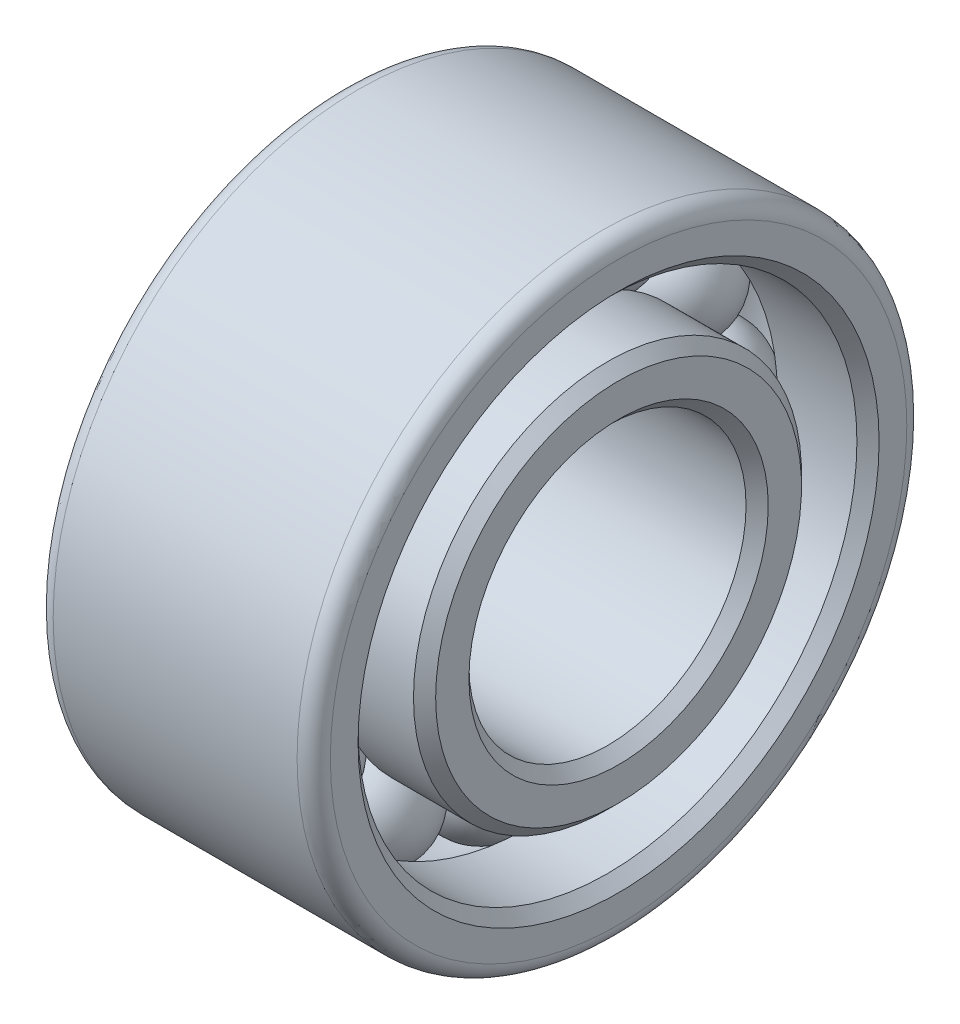
ISO-10303-21;
HEADER;
FILE_DESCRIPTION(('STEP AP214'),'2;1');
FILE_NAME('part.step','',(''),(''),'','','');
FILE_SCHEMA(('AUTOMOTIVE_DESIGN { 1 0 10303 214 1 1 1 1 }'));
ENDSEC;
DATA;
#1=APPLICATION_CONTEXT('core data for automotive mechanical design processes');
#2=APPLICATION_PROTOCOL_DEFINITION('international standard','automotive_design',2000,#1);
#3=PRODUCT_CONTEXT('',#1,'mechanical');
#4=PRODUCT('Part','Part','',(#3));
#5=PRODUCT_RELATED_PRODUCT_CATEGORY('part','',(#4));
#6=PRODUCT_DEFINITION_FORMATION('','',#4);
#7=PRODUCT_DEFINITION_CONTEXT('part definition',#1,'design');
#8=PRODUCT_DEFINITION('design','',#6,#7);
#9=PRODUCT_DEFINITION_SHAPE('','',#8);
#10=(LENGTH_UNIT() NAMED_UNIT(*) SI_UNIT(.MILLI.,.METRE.));
#11=(NAMED_UNIT(*) PLANE_ANGLE_UNIT() SI_UNIT($,.RADIAN.));
#12=(NAMED_UNIT(*) SI_UNIT($,.STERADIAN.) SOLID_ANGLE_UNIT());
#13=UNCERTAINTY_MEASURE_WITH_UNIT(LENGTH_MEASURE(1.E-05),#10,'distance_accuracy_value','');
#14=(GEOMETRIC_REPRESENTATION_CONTEXT(3) GLOBAL_UNCERTAINTY_ASSIGNED_CONTEXT((#13)) GLOBAL_UNIT_ASSIGNED_CONTEXT((#10,
#11,#12)) REPRESENTATION_CONTEXT('',''));
#15=CARTESIAN_POINT('',(0.,0.,0.));
#16=DIRECTION('',(0.,0.,1.));
#17=DIRECTION('',(1.,0.,0.));
#18=AXIS2_PLACEMENT_3D('',#15,#16,#17);
#19=CARTESIAN_POINT('',(2.5,0.96410161513778,1.99999999999996));
#20=DIRECTION('',(0.,0.866025403784445,0.499999999999989));
#21=DIRECTION('',(-1.,0.,0.));
#22=AXIS2_PLACEMENT_3D('',#19,#20,#21);
#23=SPHERICAL_SURFACE('',#22,1.);
#24=CARTESIAN_POINT('',(2.5,1.83012701892222,2.49999999999994));
#25=VERTEX_POINT('',#24);
#26=VERTEX_LOOP('',#25);
#27=FACE_BOUND('',#26,.T.);
#28=ADVANCED_FACE('F39',(#27),#23,.T.);
#29=CLOSED_SHELL('',(#28));
#30=MANIFOLD_SOLID_BREP('B2',#29);
#31=CARTESIAN_POINT('',(2.5,-0.49999999999996,3.46410161513773));
#32=DIRECTION('',(0.,0.50000000000001,0.866025403784433));
#33=DIRECTION('',(-1.,0.,0.));
#34=AXIS2_PLACEMENT_3D('',#31,#32,#33);
#35=SPHERICAL_SURFACE('',#34,1.);
#36=CARTESIAN_POINT('',(2.5,0.,4.33012701892216));
#37=VERTEX_POINT('',#36);
#38=VERTEX_LOOP('',#37);
#39=FACE_BOUND('',#38,.T.);
#40=ADVANCED_FACE('F59',(#39),#35,.T.);
#41=CLOSED_SHELL('',(#40));
#42=MANIFOLD_SOLID_BREP('B6',#41);
#43=CARTESIAN_POINT('',(2.5,-2.49999999999996,4.));
#44=DIRECTION('',(0.,0.,1.));
#45=DIRECTION('',(-1.,0.,0.));
#46=AXIS2_PLACEMENT_3D('',#43,#44,#45);
#47=SPHERICAL_SURFACE('',#46,1.);
#48=CARTESIAN_POINT('',(2.5,-2.49999999999995,5.));
#49=VERTEX_POINT('',#48);
#50=VERTEX_LOOP('',#49);
#51=FACE_BOUND('',#50,.T.);
#52=ADVANCED_FACE('F79',(#51),#47,.T.);
#53=CLOSED_SHELL('',(#52));
#54=MANIFOLD_SOLID_BREP('B35',#53);
#55=CARTESIAN_POINT('',(2.5,-4.49999999999997,3.46410161513777));
#56=DIRECTION('',(0.,-0.499999999999992,0.866025403784443));
#57=DIRECTION('',(-1.,0.,0.));
#58=AXIS2_PLACEMENT_3D('',#55,#56,#57);
#59=SPHERICAL_SURFACE('',#58,1.);
#60=CARTESIAN_POINT('',(2.5,-4.99999999999996,4.33012701892222));
#61=VERTEX_POINT('',#60);
#62=VERTEX_LOOP('',#61);
#63=FACE_BOUND('',#62,.T.);
#64=ADVANCED_FACE('F99',(#63),#59,.T.);
#65=CLOSED_SHELL('',(#64));
#66=MANIFOLD_SOLID_BREP('B55',#65);
#67=CARTESIAN_POINT('',(2.5,-5.96410161513774,2.00000000000003));
#68=DIRECTION('',(0.,-0.866025403784435,0.500000000000007));
#69=DIRECTION('',(-1.,0.,0.));
#70=AXIS2_PLACEMENT_3D('',#67,#68,#69);
#71=SPHERICAL_SURFACE('',#70,1.);
#72=CARTESIAN_POINT('',(2.5,-6.83012701892217,2.50000000000004));
#73=VERTEX_POINT('',#72);
#74=VERTEX_LOOP('',#73);
#75=FACE_BOUND('',#74,.T.);
#76=ADVANCED_FACE('F119',(#75),#71,.T.);
#77=CLOSED_SHELL('',(#76));
#78=MANIFOLD_SOLID_BREP('B75',#77);
#79=CARTESIAN_POINT('',(2.5,-6.5,0.));
#80=DIRECTION('',(0.,-1.,0.));
#81=DIRECTION('',(-1.,0.,0.));
#82=AXIS2_PLACEMENT_3D('',#79,#80,#81);
#83=SPHERICAL_SURFACE('',#82,1.);
#84=CARTESIAN_POINT('',(2.5,-7.5,0.));
#85=VERTEX_POINT('',#84);
#86=VERTEX_LOOP('',#85);
#87=FACE_BOUND('',#86,.T.);
#88=ADVANCED_FACE('F139',(#87),#83,.T.);
#89=CLOSED_SHELL('',(#88));
#90=MANIFOLD_SOLID_BREP('B95',#89);
#91=CARTESIAN_POINT('',(2.5,-5.96410161513777,-1.99999999999998));
#92=DIRECTION('',(0.,-0.866025403784442,-0.499999999999995));
#93=DIRECTION('',(-1.,0.,0.));
#94=AXIS2_PLACEMENT_3D('',#91,#92,#93);
#95=SPHERICAL_SURFACE('',#94,1.);
#96=CARTESIAN_POINT('',(2.5,-6.83012701892221,-2.49999999999997));
#97=VERTEX_POINT('',#96);
#98=VERTEX_LOOP('',#97);
#99=FACE_BOUND('',#98,.T.);
#100=ADVANCED_FACE('F159',(#99),#95,.T.);
#101=CLOSED_SHELL('',(#100));
#102=MANIFOLD_SOLID_BREP('B115',#101);
#103=CARTESIAN_POINT('',(2.5,-4.50000000000002,-3.46410161513775));
#104=DIRECTION('',(0.,-0.500000000000004,-0.866025403784436));
#105=DIRECTION('',(-1.,0.,0.));
#106=AXIS2_PLACEMENT_3D('',#103,#104,#105);
#107=SPHERICAL_SURFACE('',#106,1.);
#108=CARTESIAN_POINT('',(2.5,-5.00000000000002,-4.33012701892218));
#109=VERTEX_POINT('',#108);
#110=VERTEX_LOOP('',#109);
#111=FACE_BOUND('',#110,.T.);
#112=ADVANCED_FACE('F179',(#111),#107,.T.);
#113=CLOSED_SHELL('',(#112));
#114=MANIFOLD_SOLID_BREP('B135',#113);
#115=CARTESIAN_POINT('',(2.5,-2.50000000000001,-4.));
#116=DIRECTION('',(0.,0.,-1.));
#117=DIRECTION('',(-1.,0.,0.));
#118=AXIS2_PLACEMENT_3D('',#115,#116,#117);
#119=SPHERICAL_SURFACE('',#118,1.);
#120=CARTESIAN_POINT('',(2.5,-2.50000000000002,-5.));
#121=VERTEX_POINT('',#120);
#122=VERTEX_LOOP('',#121);
#123=FACE_BOUND('',#122,.T.);
#124=ADVANCED_FACE('F199',(#123),#119,.T.);
#125=CLOSED_SHELL('',(#124));
#126=MANIFOLD_SOLID_BREP('B155',#125);
#127=CARTESIAN_POINT('',(2.5,-0.500000000000008,-3.46410161513776));
#128=DIRECTION('',(0.,0.499999999999998,-0.86602540378444));
#129=DIRECTION('',(-1.,0.,0.));
#130=AXIS2_PLACEMENT_3D('',#127,#128,#129);
#131=SPHERICAL_SURFACE('',#130,1.);
#132=CARTESIAN_POINT('',(2.5,0.,-4.3301270189222));
#133=VERTEX_POINT('',#132);
#134=VERTEX_LOOP('',#133);
#135=FACE_BOUND('',#134,.T.);
#136=ADVANCED_FACE('F219',(#135),#131,.T.);
#137=CLOSED_SHELL('',(#136));
#138=MANIFOLD_SOLID_BREP('B175',#137);
#139=CARTESIAN_POINT('',(2.5,0.964101615137752,-2.));
#140=DIRECTION('',(0.,0.866025403784438,-0.500000000000001));
#141=DIRECTION('',(-1.,0.,0.));
#142=AXIS2_PLACEMENT_3D('',#139,#140,#141);
#143=SPHERICAL_SURFACE('',#142,1.);
#144=CARTESIAN_POINT('',(2.5,1.83012701892219,-2.5));
#145=VERTEX_POINT('',#144);
#146=VERTEX_LOOP('',#145);
#147=FACE_BOUND('',#146,.T.);
#148=ADVANCED_FACE('F239',(#147),#143,.T.);
#149=CLOSED_SHELL('',(#148));
#150=MANIFOLD_SOLID_BREP('B195',#149);
#151=CARTESIAN_POINT('',(2.5,1.5,0.));
#152=DIRECTION('',(0.,1.,0.));
#153=DIRECTION('',(-1.,0.,0.));
#154=AXIS2_PLACEMENT_3D('',#151,#152,#153);
#155=SPHERICAL_SURFACE('',#154,1.);
#156=CARTESIAN_POINT('',(2.5,2.5,0.));
#157=VERTEX_POINT('',#156);
#158=VERTEX_LOOP('',#157);
#159=FACE_BOUND('',#158,.T.);
#160=ADVANCED_FACE('F261',(#159),#155,.T.);
#161=CLOSED_SHELL('',(#160));
#162=MANIFOLD_SOLID_BREP('B215',#161);
#163=CARTESIAN_POINT('',(0.,2.,0.));
#164=DIRECTION('',(1.,0.,0.));
#165=DIRECTION('',(0.,0.,-1.));
#166=AXIS2_PLACEMENT_3D('',#163,#164,#165);
#167=PLANE('',#166);
#168=CARTESIAN_POINT('',(0.,-2.5,0.));
#169=DIRECTION('',(1.,0.,0.));
#170=DIRECTION('',(0.,0.,-1.));
#171=AXIS2_PLACEMENT_3D('',#168,#169,#170);
#172=CIRCLE('',#171,4.7);
#173=CARTESIAN_POINT('',(0.,-2.5,-4.7));
#174=VERTEX_POINT('',#173);
#175=EDGE_CURVE('E291',#174,#174,#172,.T.);
#176=ORIENTED_EDGE('',*,*,#175,.T.);
#177=EDGE_LOOP('',(#176));
#178=FACE_BOUND('',#177,.T.);
#179=CARTESIAN_POINT('',(0.,-2.5,0.));
#180=DIRECTION('',(1.,0.,0.));
#181=DIRECTION('',(0.,0.,-1.));
#182=AXIS2_PLACEMENT_3D('',#179,#180,#181);
#183=CIRCLE('',#182,5.2);
#184=CARTESIAN_POINT('',(0.,-2.5,-5.2));
#185=VERTEX_POINT('',#184);
#186=EDGE_CURVE('E300',#185,#185,#183,.F.);
#187=ORIENTED_EDGE('',*,*,#186,.T.);
#188=EDGE_LOOP('',(#187));
#189=FACE_BOUND('',#188,.T.);
#190=ADVANCED_FACE('F280',(#178,#189),#167,.F.);
#191=CARTESIAN_POINT('',(-1.0669014084507,-2.5,0.));
#192=DIRECTION('',(-1.,0.,0.));
#193=DIRECTION('',(0.,0.,1.));
#194=AXIS2_PLACEMENT_3D('',#191,#192,#193);
#195=CYLINDRICAL_SURFACE('',#194,4.5);
#196=CARTESIAN_POINT('',(0.199999999999998,-2.5,0.));
#197=DIRECTION('',(1.,0.,0.));
#198=DIRECTION('',(0.,0.,-1.));
#199=AXIS2_PLACEMENT_3D('',#196,#197,#198);
#200=CIRCLE('',#199,4.5);
#201=CARTESIAN_POINT('',(0.199999999999998,-2.5,-4.5));
#202=VERTEX_POINT('',#201);
#203=EDGE_CURVE('E295',#202,#202,#200,.F.);
#204=ORIENTED_EDGE('',*,*,#203,.T.);
#205=EDGE_LOOP('',(#204));
#206=FACE_BOUND('',#205,.T.);
#207=CARTESIAN_POINT('',(1.63397459621556,-2.5,0.));
#208=DIRECTION('',(-1.,0.,0.));
#209=DIRECTION('',(0.,0.,1.));
#210=AXIS2_PLACEMENT_3D('',#207,#208,#209);
#211=CIRCLE('',#210,4.5);
#212=CARTESIAN_POINT('',(1.63397459621556,-2.5,4.5));
#213=VERTEX_POINT('',#212);
#214=EDGE_CURVE('E312',#213,#213,#211,.T.);
#215=ORIENTED_EDGE('',*,*,#214,.F.);
#216=EDGE_LOOP('',(#215));
#217=FACE_BOUND('',#216,.T.);
#218=ADVANCED_FACE('F324',(#206,#217),#195,.F.);
#219=CARTESIAN_POINT('',(2.5,-2.5,0.));
#220=DIRECTION('',(-1.,0.,0.));
#221=DIRECTION('',(0.,0.,1.));
#222=AXIS2_PLACEMENT_3D('',#219,#220,#221);
#223=TOROIDAL_SURFACE('',#222,4.,1.);
#224=CARTESIAN_POINT('',(3.36602540378444,-2.5,0.));
#225=DIRECTION('',(-1.,0.,0.));
#226=DIRECTION('',(0.,0.,1.));
#227=AXIS2_PLACEMENT_3D('',#224,#225,#226);
#228=CIRCLE('',#227,4.5);
#229=CARTESIAN_POINT('',(3.36602540378444,-2.5,4.5));
#230=VERTEX_POINT('',#229);
#231=EDGE_CURVE('E315',#230,#230,#228,.T.);
#232=ORIENTED_EDGE('',*,*,#231,.F.);
#233=EDGE_LOOP('',(#232));
#234=FACE_BOUND('',#233,.T.);
#235=ORIENTED_EDGE('',*,*,#214,.T.);
#236=EDGE_LOOP('',(#235));
#237=FACE_BOUND('',#236,.T.);
#238=ADVANCED_FACE('F321',(#234,#237),#223,.F.);
#239=CARTESIAN_POINT('',(-1.0669014084507,-2.5,0.));
#240=DIRECTION('',(-1.,0.,0.));
#241=DIRECTION('',(0.,0.,1.));
#242=AXIS2_PLACEMENT_3D('',#239,#240,#241);
#243=CYLINDRICAL_SURFACE('',#242,4.5);
#244=CARTESIAN_POINT('',(4.8,-2.5,0.));
#245=DIRECTION('',(-1.,0.,0.));
#246=DIRECTION('',(0.,0.,1.));
#247=AXIS2_PLACEMENT_3D('',#244,#245,#246);
#248=CIRCLE('',#247,4.5);
#249=CARTESIAN_POINT('',(4.8,-2.5,4.5));
#250=VERTEX_POINT('',#249);
#251=EDGE_CURVE('E260',#250,#250,#248,.F.);
#252=ORIENTED_EDGE('',*,*,#251,.T.);
#253=EDGE_LOOP('',(#252));
#254=FACE_BOUND('',#253,.T.);
#255=ORIENTED_EDGE('',*,*,#231,.T.);
#256=EDGE_LOOP('',(#255));
#257=FACE_BOUND('',#256,.T.);
#258=ADVANCED_FACE('F319',(#254,#257),#243,.F.);
#259=CARTESIAN_POINT('',(5.,2.,0.));
#260=DIRECTION('',(-1.,0.,0.));
#261=DIRECTION('',(0.,0.,1.));
#262=AXIS2_PLACEMENT_3D('',#259,#260,#261);
#263=PLANE('',#262);
#264=CARTESIAN_POINT('',(5.,-2.5,0.));
#265=DIRECTION('',(-1.,0.,0.));
#266=DIRECTION('',(0.,0.,1.));
#267=AXIS2_PLACEMENT_3D('',#264,#265,#266);
#268=CIRCLE('',#267,4.7);
#269=CARTESIAN_POINT('',(5.,-2.5,4.7));
#270=VERTEX_POINT('',#269);
#271=EDGE_CURVE('E287',#270,#270,#268,.T.);
#272=ORIENTED_EDGE('',*,*,#271,.T.);
#273=EDGE_LOOP('',(#272));
#274=FACE_BOUND('',#273,.T.);
#275=CARTESIAN_POINT('',(5.,-2.5,0.));
#276=DIRECTION('',(-1.,0.,0.));
#277=DIRECTION('',(0.,0.,1.));
#278=AXIS2_PLACEMENT_3D('',#275,#276,#277);
#279=CIRCLE('',#278,5.2);
#280=CARTESIAN_POINT('',(5.,-2.5,5.2));
#281=VERTEX_POINT('',#280);
#282=EDGE_CURVE('E303',#281,#281,#279,.F.);
#283=ORIENTED_EDGE('',*,*,#282,.T.);
#284=EDGE_LOOP('',(#283));
#285=FACE_BOUND('',#284,.T.);
#286=ADVANCED_FACE('F372',(#274,#285),#263,.F.);
#287=CARTESIAN_POINT('',(-1.0669014084507,-2.5,0.));
#288=DIRECTION('',(-1.,0.,0.));
#289=DIRECTION('',(0.,0.,1.));
#290=AXIS2_PLACEMENT_3D('',#287,#288,#289);
#291=CYLINDRICAL_SURFACE('',#290,5.5);
#292=CARTESIAN_POINT('',(4.7,-2.5,0.));
#293=DIRECTION('',(-1.,0.,0.));
#294=DIRECTION('',(0.,0.,1.));
#295=AXIS2_PLACEMENT_3D('',#292,#293,#294);
#296=CIRCLE('',#295,5.5);
#297=CARTESIAN_POINT('',(4.7,-2.5,5.5));
#298=VERTEX_POINT('',#297);
#299=EDGE_CURVE('E306',#298,#298,#296,.T.);
#300=ORIENTED_EDGE('',*,*,#299,.T.);
#301=EDGE_LOOP('',(#300));
#302=FACE_BOUND('',#301,.T.);
#303=CARTESIAN_POINT('',(0.3,-2.5,0.));
#304=DIRECTION('',(1.,0.,0.));
#305=DIRECTION('',(0.,0.,-1.));
#306=AXIS2_PLACEMENT_3D('',#303,#304,#305);
#307=CIRCLE('',#306,5.5);
#308=CARTESIAN_POINT('',(0.3,-2.5,-5.5));
#309=VERTEX_POINT('',#308);
#310=EDGE_CURVE('E309',#309,#309,#307,.T.);
#311=ORIENTED_EDGE('',*,*,#310,.T.);
#312=EDGE_LOOP('',(#311));
#313=FACE_BOUND('',#312,.T.);
#314=ADVANCED_FACE('F342',(#302,#313),#291,.T.);
#315=CARTESIAN_POINT('',(4.7,-2.5,0.));
#316=DIRECTION('',(-1.,0.,0.));
#317=DIRECTION('',(0.,0.,1.));
#318=AXIS2_PLACEMENT_3D('',#315,#316,#317);
#319=TOROIDAL_SURFACE('',#318,5.2,0.3);
#320=ORIENTED_EDGE('',*,*,#282,.F.);
#321=EDGE_LOOP('',(#320));
#322=FACE_BOUND('',#321,.T.);
#323=ORIENTED_EDGE('',*,*,#299,.F.);
#324=EDGE_LOOP('',(#323));
#325=FACE_BOUND('',#324,.T.);
#326=ADVANCED_FACE('F338',(#322,#325),#319,.T.);
#327=CARTESIAN_POINT('',(0.3,-2.5,0.));
#328=DIRECTION('',(1.,0.,0.));
#329=DIRECTION('',(0.,0.,-1.));
#330=AXIS2_PLACEMENT_3D('',#327,#328,#329);
#331=TOROIDAL_SURFACE('',#330,5.2,0.3);
#332=ORIENTED_EDGE('',*,*,#310,.F.);
#333=EDGE_LOOP('',(#332));
#334=FACE_BOUND('',#333,.T.);
#335=ORIENTED_EDGE('',*,*,#186,.F.);
#336=EDGE_LOOP('',(#335));
#337=FACE_BOUND('',#336,.T.);
#338=ADVANCED_FACE('F341',(#334,#337),#331,.T.);
#339=CARTESIAN_POINT('',(0.199999999999998,-2.5,0.));
#340=DIRECTION('',(-1.,0.,0.));
#341=DIRECTION('',(0.,0.,1.));
#342=AXIS2_PLACEMENT_3D('',#339,#340,#341);
#343=CONICAL_SURFACE('',#342,4.5,0.785398163397448);
#344=ORIENTED_EDGE('',*,*,#175,.F.);
#345=EDGE_LOOP('',(#344));
#346=FACE_BOUND('',#345,.T.);
#347=ORIENTED_EDGE('',*,*,#203,.F.);
#348=EDGE_LOOP('',(#347));
#349=FACE_BOUND('',#348,.T.);
#350=ADVANCED_FACE('F345',(#346,#349),#343,.F.);
#351=CARTESIAN_POINT('',(5.,-2.5,0.));
#352=DIRECTION('',(1.,0.,0.));
#353=DIRECTION('',(0.,0.,-1.));
#354=AXIS2_PLACEMENT_3D('',#351,#352,#353);
#355=CONICAL_SURFACE('',#354,4.7,0.785398163397448);
#356=ORIENTED_EDGE('',*,*,#251,.F.);
#357=EDGE_LOOP('',(#356));
#358=FACE_BOUND('',#357,.T.);
#359=ORIENTED_EDGE('',*,*,#271,.F.);
#360=EDGE_LOOP('',(#359));
#361=FACE_BOUND('',#360,.T.);
#362=ADVANCED_FACE('F282',(#358,#361),#355,.F.);
#363=CLOSED_SHELL('',(#190,#218,#238,#258,#286,#314,#326,#338,#350,#362));
#364=MANIFOLD_SOLID_BREP('B235',#363);
#365=CARTESIAN_POINT('',(0.,0.,0.));
#366=DIRECTION('',(1.,0.,0.));
#367=DIRECTION('',(0.,0.,-1.));
#368=AXIS2_PLACEMENT_3D('',#365,#366,#367);
#369=PLANE('',#368);
#370=CARTESIAN_POINT('',(0.,-2.5,0.));
#371=DIRECTION('',(1.,0.,0.));
#372=DIRECTION('',(0.,0.,-1.));
#373=AXIS2_PLACEMENT_3D('',#370,#371,#372);
#374=CIRCLE('',#373,3.3);
#375=CARTESIAN_POINT('',(0.,-2.5,-3.3));
#376=VERTEX_POINT('',#375);
#377=EDGE_CURVE('E438',#376,#376,#374,.F.);
#378=ORIENTED_EDGE('',*,*,#377,.T.);
#379=EDGE_LOOP('',(#378));
#380=FACE_BOUND('',#379,.T.);
#381=CARTESIAN_POINT('',(0.,-2.5,0.));
#382=DIRECTION('',(1.,0.,0.));
#383=DIRECTION('',(0.,0.,-1.));
#384=AXIS2_PLACEMENT_3D('',#381,#382,#383);
#385=CIRCLE('',#384,2.7);
#386=CARTESIAN_POINT('',(0.,-2.5,-2.7));
#387=VERTEX_POINT('',#386);
#388=EDGE_CURVE('E454',#387,#387,#385,.T.);
#389=ORIENTED_EDGE('',*,*,#388,.T.);
#390=EDGE_LOOP('',(#389));
#391=FACE_BOUND('',#390,.T.);
#392=ADVANCED_FACE('F431',(#380,#391),#369,.F.);
#393=CARTESIAN_POINT('',(-1.0669014084507,-2.5,0.));
#394=DIRECTION('',(-1.,0.,0.));
#395=DIRECTION('',(0.,0.,1.));
#396=AXIS2_PLACEMENT_3D('',#393,#394,#395);
#397=CYLINDRICAL_SURFACE('',#396,2.5);
#398=CARTESIAN_POINT('',(0.199999999999999,-2.5,0.));
#399=DIRECTION('',(1.,0.,0.));
#400=DIRECTION('',(0.,0.,-1.));
#401=AXIS2_PLACEMENT_3D('',#398,#399,#400);
#402=CIRCLE('',#401,2.5);
#403=CARTESIAN_POINT('',(0.199999999999999,-2.5,-2.5));
#404=VERTEX_POINT('',#403);
#405=EDGE_CURVE('E457',#404,#404,#402,.F.);
#406=ORIENTED_EDGE('',*,*,#405,.T.);
#407=EDGE_LOOP('',(#406));
#408=FACE_BOUND('',#407,.T.);
#409=CARTESIAN_POINT('',(4.8,-2.5,0.));
#410=DIRECTION('',(-1.,0.,0.));
#411=DIRECTION('',(0.,0.,1.));
#412=AXIS2_PLACEMENT_3D('',#409,#410,#411);
#413=CIRCLE('',#412,2.5);
#414=CARTESIAN_POINT('',(4.8,-2.5,2.5));
#415=VERTEX_POINT('',#414);
#416=EDGE_CURVE('E460',#415,#415,#413,.F.);
#417=ORIENTED_EDGE('',*,*,#416,.T.);
#418=EDGE_LOOP('',(#417));
#419=FACE_BOUND('',#418,.T.);
#420=ADVANCED_FACE('F486',(#408,#419),#397,.F.);
#421=CARTESIAN_POINT('',(5.,0.,0.));
#422=DIRECTION('',(-1.,0.,0.));
#423=DIRECTION('',(0.,0.,1.));
#424=AXIS2_PLACEMENT_3D('',#421,#422,#423);
#425=PLANE('',#424);
#426=CARTESIAN_POINT('',(5.,-2.5,0.));
#427=DIRECTION('',(-1.,0.,0.));
#428=DIRECTION('',(0.,0.,1.));
#429=AXIS2_PLACEMENT_3D('',#426,#427,#428);
#430=CIRCLE('',#429,3.3);
#431=CARTESIAN_POINT('',(5.,-2.5,3.3));
#432=VERTEX_POINT('',#431);
#433=EDGE_CURVE('E442',#432,#432,#430,.F.);
#434=ORIENTED_EDGE('',*,*,#433,.T.);
#435=EDGE_LOOP('',(#434));
#436=FACE_BOUND('',#435,.T.);
#437=CARTESIAN_POINT('',(5.,-2.5,0.));
#438=DIRECTION('',(-1.,0.,0.));
#439=DIRECTION('',(0.,0.,1.));
#440=AXIS2_PLACEMENT_3D('',#437,#438,#439);
#441=CIRCLE('',#440,2.7);
#442=CARTESIAN_POINT('',(5.,-2.5,2.7));
#443=VERTEX_POINT('',#442);
#444=EDGE_CURVE('E451',#443,#443,#441,.T.);
#445=ORIENTED_EDGE('',*,*,#444,.T.);
#446=EDGE_LOOP('',(#445));
#447=FACE_BOUND('',#446,.T.);
#448=ADVANCED_FACE('F480',(#436,#447),#425,.F.);
#449=CARTESIAN_POINT('',(-1.0669014084507,-2.5,0.));
#450=DIRECTION('',(-1.,0.,0.));
#451=DIRECTION('',(0.,0.,1.));
#452=AXIS2_PLACEMENT_3D('',#449,#450,#451);
#453=CYLINDRICAL_SURFACE('',#452,3.5);
#454=CARTESIAN_POINT('',(4.8,-2.5,0.));
#455=DIRECTION('',(-1.,0.,0.));
#456=DIRECTION('',(0.,0.,1.));
#457=AXIS2_PLACEMENT_3D('',#454,#455,#456);
#458=CIRCLE('',#457,3.5);
#459=CARTESIAN_POINT('',(4.8,-2.5,3.5));
#460=VERTEX_POINT('',#459);
#461=EDGE_CURVE('E446',#460,#460,#458,.T.);
#462=ORIENTED_EDGE('',*,*,#461,.T.);
#463=EDGE_LOOP('',(#462));
#464=FACE_BOUND('',#463,.T.);
#465=CARTESIAN_POINT('',(3.36602540378444,-2.5,0.));
#466=DIRECTION('',(-1.,0.,0.));
#467=DIRECTION('',(0.,0.,1.));
#468=AXIS2_PLACEMENT_3D('',#465,#466,#467);
#469=CIRCLE('',#468,3.5);
#470=CARTESIAN_POINT('',(3.36602540378444,-2.5,3.5));
#471=VERTEX_POINT('',#470);
#472=EDGE_CURVE('E463',#471,#471,#469,.T.);
#473=ORIENTED_EDGE('',*,*,#472,.F.);
#474=EDGE_LOOP('',(#473));
#475=FACE_BOUND('',#474,.T.);
#476=ADVANCED_FACE('F475',(#464,#475),#453,.T.);
#477=CARTESIAN_POINT('',(2.5,-2.5,0.));
#478=DIRECTION('',(-1.,0.,0.));
#479=DIRECTION('',(0.,0.,1.));
#480=AXIS2_PLACEMENT_3D('',#477,#478,#479);
#481=TOROIDAL_SURFACE('',#480,4.,1.);
#482=CARTESIAN_POINT('',(1.63397459621556,-2.5,0.));
#483=DIRECTION('',(-1.,0.,0.));
#484=DIRECTION('',(0.,0.,1.));
#485=AXIS2_PLACEMENT_3D('',#482,#483,#484);
#486=CIRCLE('',#485,3.5);
#487=CARTESIAN_POINT('',(1.63397459621556,-2.5,3.5));
#488=VERTEX_POINT('',#487);
#489=EDGE_CURVE('E466',#488,#488,#486,.T.);
#490=ORIENTED_EDGE('',*,*,#489,.F.);
#491=EDGE_LOOP('',(#490));
#492=FACE_BOUND('',#491,.T.);
#493=ORIENTED_EDGE('',*,*,#472,.T.);
#494=EDGE_LOOP('',(#493));
#495=FACE_BOUND('',#494,.T.);
#496=ADVANCED_FACE('F472',(#492,#495),#481,.F.);
#497=CARTESIAN_POINT('',(-1.0669014084507,-2.5,0.));
#498=DIRECTION('',(-1.,0.,0.));
#499=DIRECTION('',(0.,0.,1.));
#500=AXIS2_PLACEMENT_3D('',#497,#498,#499);
#501=CYLINDRICAL_SURFACE('',#500,3.5);
#502=CARTESIAN_POINT('',(0.200000000000001,-2.5,0.));
#503=DIRECTION('',(1.,0.,0.));
#504=DIRECTION('',(0.,0.,-1.));
#505=AXIS2_PLACEMENT_3D('',#502,#503,#504);
#506=CIRCLE('',#505,3.5);
#507=CARTESIAN_POINT('',(0.200000000000001,-2.5,-3.5));
#508=VERTEX_POINT('',#507);
#509=EDGE_CURVE('E279',#508,#508,#506,.T.);
#510=ORIENTED_EDGE('',*,*,#509,.T.);
#511=EDGE_LOOP('',(#510));
#512=FACE_BOUND('',#511,.T.);
#513=ORIENTED_EDGE('',*,*,#489,.T.);
#514=EDGE_LOOP('',(#513));
#515=FACE_BOUND('',#514,.T.);
#516=ADVANCED_FACE('F470',(#512,#515),#501,.T.);
#517=CARTESIAN_POINT('',(0.199999999999999,-2.5,0.));
#518=DIRECTION('',(-1.,0.,0.));
#519=DIRECTION('',(0.,0.,1.));
#520=AXIS2_PLACEMENT_3D('',#517,#518,#519);
#521=CONICAL_SURFACE('',#520,2.5,0.785398163397448);
#522=ORIENTED_EDGE('',*,*,#388,.F.);
#523=EDGE_LOOP('',(#522));
#524=FACE_BOUND('',#523,.T.);
#525=ORIENTED_EDGE('',*,*,#405,.F.);
#526=EDGE_LOOP('',(#525));
#527=FACE_BOUND('',#526,.T.);
#528=ADVANCED_FACE('F498',(#524,#527),#521,.F.);
#529=CARTESIAN_POINT('',(5.,-2.5,0.));
#530=DIRECTION('',(1.,0.,0.));
#531=DIRECTION('',(0.,0.,-1.));
#532=AXIS2_PLACEMENT_3D('',#529,#530,#531);
#533=CONICAL_SURFACE('',#532,2.7,0.785398163397446);
#534=ORIENTED_EDGE('',*,*,#416,.F.);
#535=EDGE_LOOP('',(#534));
#536=FACE_BOUND('',#535,.T.);
#537=ORIENTED_EDGE('',*,*,#444,.F.);
#538=EDGE_LOOP('',(#537));
#539=FACE_BOUND('',#538,.T.);
#540=ADVANCED_FACE('F501',(#536,#539),#533,.F.);
#541=CARTESIAN_POINT('',(4.8,-2.5,0.));
#542=DIRECTION('',(-1.,0.,0.));
#543=DIRECTION('',(0.,0.,1.));
#544=AXIS2_PLACEMENT_3D('',#541,#542,#543);
#545=CONICAL_SURFACE('',#544,3.5,0.785398163397451);
#546=CARTESIAN_POINT('',(5.,-2.5,3.3));
#547=CARTESIAN_POINT('',(4.99791666666667,-2.5,3.30208333333333));
#548=CARTESIAN_POINT('',(4.99583333333333,-2.5,3.30416666666667));
#549=CARTESIAN_POINT('',(4.99166666666667,-2.5,3.30833333333333));
#550=CARTESIAN_POINT('',(4.98958333333333,-2.5,3.31041666666667));
#551=CARTESIAN_POINT('',(4.98541666666667,-2.5,3.31458333333333));
#552=CARTESIAN_POINT('',(4.98333333333333,-2.5,3.31666666666667));
#553=CARTESIAN_POINT('',(4.97916666666667,-2.5,3.32083333333333));
#554=CARTESIAN_POINT('',(4.97708333333333,-2.5,3.32291666666667));
#555=CARTESIAN_POINT('',(4.97291666666667,-2.5,3.32708333333333));
#556=CARTESIAN_POINT('',(4.97083333333333,-2.5,3.32916666666667));
#557=CARTESIAN_POINT('',(4.96666666666667,-2.5,3.33333333333333));
#558=CARTESIAN_POINT('',(4.96458333333333,-2.5,3.33541666666667));
#559=CARTESIAN_POINT('',(4.96041666666667,-2.5,3.33958333333333));
#560=CARTESIAN_POINT('',(4.95833333333333,-2.5,3.34166666666667));
#561=CARTESIAN_POINT('',(4.95416666666667,-2.5,3.34583333333333));
#562=CARTESIAN_POINT('',(4.95208333333333,-2.5,3.34791666666667));
#563=CARTESIAN_POINT('',(4.94791666666667,-2.5,3.35208333333333));
#564=CARTESIAN_POINT('',(4.94583333333333,-2.5,3.35416666666667));
#565=CARTESIAN_POINT('',(4.94166666666667,-2.5,3.35833333333333));
#566=CARTESIAN_POINT('',(4.93958333333333,-2.5,3.36041666666667));
#567=CARTESIAN_POINT('',(4.93541666666667,-2.5,3.36458333333333));
#568=CARTESIAN_POINT('',(4.93333333333333,-2.5,3.36666666666667));
#569=CARTESIAN_POINT('',(4.92916666666667,-2.5,3.37083333333333));
#570=CARTESIAN_POINT('',(4.92708333333333,-2.5,3.37291666666667));
#571=CARTESIAN_POINT('',(4.92291666666667,-2.5,3.37708333333333));
#572=CARTESIAN_POINT('',(4.92083333333333,-2.5,3.37916666666667));
#573=CARTESIAN_POINT('',(4.91666666666667,-2.5,3.38333333333333));
#574=CARTESIAN_POINT('',(4.91458333333333,-2.5,3.38541666666667));
#575=CARTESIAN_POINT('',(4.91041666666667,-2.5,3.38958333333333));
#576=CARTESIAN_POINT('',(4.90833333333333,-2.5,3.39166666666667));
#577=CARTESIAN_POINT('',(4.90416666666667,-2.5,3.39583333333333));
#578=CARTESIAN_POINT('',(4.90208333333333,-2.5,3.39791666666667));
#579=CARTESIAN_POINT('',(4.89791666666667,-2.5,3.40208333333333));
#580=CARTESIAN_POINT('',(4.89583333333333,-2.5,3.40416666666667));
#581=CARTESIAN_POINT('',(4.89166666666667,-2.5,3.40833333333333));
#582=CARTESIAN_POINT('',(4.88958333333333,-2.5,3.41041666666667));
#583=CARTESIAN_POINT('',(4.88541666666667,-2.5,3.41458333333333));
#584=CARTESIAN_POINT('',(4.88333333333333,-2.5,3.41666666666667));
#585=CARTESIAN_POINT('',(4.87916666666667,-2.5,3.42083333333333));
#586=CARTESIAN_POINT('',(4.87708333333333,-2.5,3.42291666666667));
#587=CARTESIAN_POINT('',(4.87291666666667,-2.5,3.42708333333333));
#588=CARTESIAN_POINT('',(4.87083333333333,-2.5,3.42916666666667));
#589=CARTESIAN_POINT('',(4.86666666666667,-2.5,3.43333333333333));
#590=CARTESIAN_POINT('',(4.86458333333333,-2.5,3.43541666666667));
#591=CARTESIAN_POINT('',(4.86041666666667,-2.5,3.43958333333333));
#592=CARTESIAN_POINT('',(4.85833333333333,-2.5,3.44166666666667));
#593=CARTESIAN_POINT('',(4.85416666666667,-2.5,3.44583333333333));
#594=CARTESIAN_POINT('',(4.85208333333333,-2.5,3.44791666666667));
#595=CARTESIAN_POINT('',(4.84791666666667,-2.5,3.45208333333333));
#596=CARTESIAN_POINT('',(4.84583333333333,-2.5,3.45416666666667));
#597=CARTESIAN_POINT('',(4.84166666666667,-2.5,3.45833333333333));
#598=CARTESIAN_POINT('',(4.83958333333333,-2.5,3.46041666666667));
#599=CARTESIAN_POINT('',(4.83541666666667,-2.5,3.46458333333333));
#600=CARTESIAN_POINT('',(4.83333333333333,-2.5,3.46666666666667));
#601=CARTESIAN_POINT('',(4.82916666666667,-2.5,3.47083333333333));
#602=CARTESIAN_POINT('',(4.82708333333333,-2.5,3.47291666666667));
#603=CARTESIAN_POINT('',(4.82291666666667,-2.5,3.47708333333333));
#604=CARTESIAN_POINT('',(4.82083333333333,-2.5,3.47916666666667));
#605=CARTESIAN_POINT('',(4.81666666666667,-2.5,3.48333333333333));
#606=CARTESIAN_POINT('',(4.81458333333333,-2.5,3.48541666666667));
#607=CARTESIAN_POINT('',(4.81041666666667,-2.5,3.48958333333333));
#608=CARTESIAN_POINT('',(4.80833333333333,-2.5,3.49166666666667));
#609=CARTESIAN_POINT('',(4.80416666666667,-2.5,3.49583333333333));
#610=CARTESIAN_POINT('',(4.80208333333333,-2.5,3.49791666666667));
#611=CARTESIAN_POINT('',(4.8,-2.5,3.5));
#612=B_SPLINE_CURVE_WITH_KNOTS('',3,(#546,#547,#548,#549,#550,#551,#552,#553,#554,#555,#556,
#557,#558,#559,#560,#561,#562,#563,#564,#565,#566,#567,#568,#569,#570,#571,#572,#573,#574,#575,
#576,#577,#578,#579,#580,#581,#582,#583,#584,#585,#586,#587,#588,#589,#590,#591,#592,#593,#594,
#595,#596,#597,#598,#599,#600,#601,#602,#603,#604,#605,#606,#607,#608,#609,#610,#611),
.UNSPECIFIED.,.F.,.F.,(4,2,2,2,2,2,2,2,2,2,2,2,2,2,2,2,2,2,2,2,2,2,2,2,2,2,2,2,2,2,2,2,4),(0.,
0.00883883476483148,0.0176776695296633,0.0265165042944954,0.0353553390593275,0.0441941738241586,
0.0530330085889907,0.0618718433538228,0.0707106781186546,0.0795495128834867,0.0883883476483182,
0.09722718241315,0.106066017177982,0.114904851942814,0.123743686707645,0.132582521472477,
0.141421356237309,0.150260191002141,0.159099025766973,0.167937860531805,0.176776695296637,
0.185615530061469,0.194454364826301,0.203293199591132,0.212132034355964,0.220970869120796,
0.229809703885628,0.23864853865046,0.247487373415291,0.256326208180123,0.265165042944956,
0.274003877709787,0.282842712474619),.UNSPECIFIED.);
#613=EDGE_CURVE('BSEAM504',#432,#460,#612,.T.);
#614=ORIENTED_EDGE('',*,*,#433,.F.);
#615=ORIENTED_EDGE('',*,*,#461,.F.);
#616=ORIENTED_EDGE('',*,*,#613,.T.);
#617=ORIENTED_EDGE('',*,*,#613,.F.);
#618=EDGE_LOOP('',(#614,#616,#615,#617));
#619=FACE_BOUND('',#618,.T.);
#620=ADVANCED_FACE('F504',(#619),#545,.T.);
#621=CARTESIAN_POINT('',(0.,-2.5,0.));
#622=DIRECTION('',(1.,0.,0.));
#623=DIRECTION('',(0.,0.,-1.));
#624=AXIS2_PLACEMENT_3D('',#621,#622,#623);
#625=CONICAL_SURFACE('',#624,3.3,0.785398163397445);
#626=ORIENTED_EDGE('',*,*,#509,.F.);
#627=EDGE_LOOP('',(#626));
#628=FACE_BOUND('',#627,.T.);
#629=ORIENTED_EDGE('',*,*,#377,.F.);
#630=EDGE_LOOP('',(#629));
#631=FACE_BOUND('',#630,.T.);
#632=ADVANCED_FACE('F433',(#628,#631),#625,.T.);
#633=CLOSED_SHELL('',(#392,#420,#448,#476,#496,#516,#528,#540,#620,#632));
#634=MANIFOLD_SOLID_BREP('B255',#633);
#635=ADVANCED_BREP_SHAPE_REPRESENTATION('',(#18,#30,#42,#54,#66,#78,#90,#102,#114,#126,#138,
#150,#162,#364,#634),#14);
#636=SHAPE_DEFINITION_REPRESENTATION(#9,#635);
ENDSEC;
END-ISO-10303-21;
